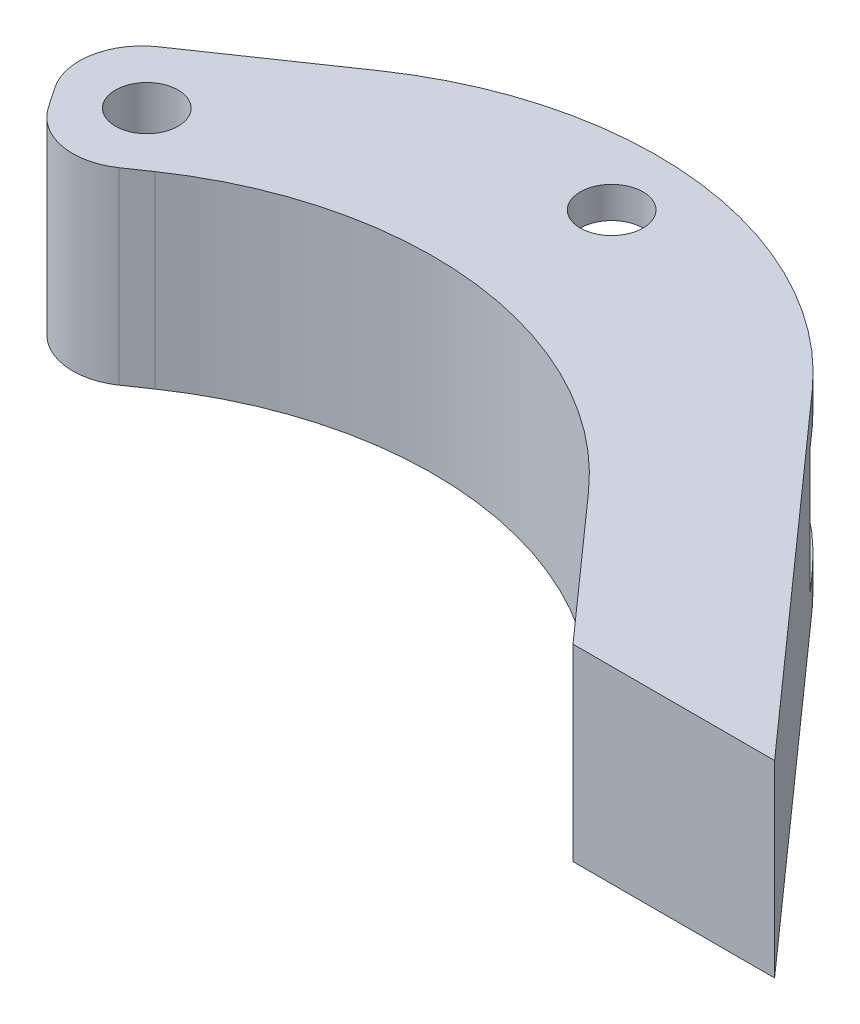
ISO-10303-21;
HEADER;
FILE_DESCRIPTION(('STEP AP214'),'2;1');
FILE_NAME('part.step','',(''),(''),'','','');
FILE_SCHEMA(('AUTOMOTIVE_DESIGN { 1 0 10303 214 1 1 1 1 }'));
ENDSEC;
DATA;
#1=APPLICATION_CONTEXT('core data for automotive mechanical design processes');
#2=APPLICATION_PROTOCOL_DEFINITION('international standard','automotive_design',2000,#1);
#3=PRODUCT_CONTEXT('',#1,'mechanical');
#4=PRODUCT('Part','Part','',(#3));
#5=PRODUCT_RELATED_PRODUCT_CATEGORY('part','',(#4));
#6=PRODUCT_DEFINITION_FORMATION('','',#4);
#7=PRODUCT_DEFINITION_CONTEXT('part definition',#1,'design');
#8=PRODUCT_DEFINITION('design','',#6,#7);
#9=PRODUCT_DEFINITION_SHAPE('','',#8);
#10=(LENGTH_UNIT() NAMED_UNIT(*) SI_UNIT(.MILLI.,.METRE.));
#11=(NAMED_UNIT(*) PLANE_ANGLE_UNIT() SI_UNIT($,.RADIAN.));
#12=(NAMED_UNIT(*) SI_UNIT($,.STERADIAN.) SOLID_ANGLE_UNIT());
#13=UNCERTAINTY_MEASURE_WITH_UNIT(LENGTH_MEASURE(1.E-05),#10,'distance_accuracy_value','');
#14=(GEOMETRIC_REPRESENTATION_CONTEXT(3) GLOBAL_UNCERTAINTY_ASSIGNED_CONTEXT((#13)) GLOBAL_UNIT_ASSIGNED_CONTEXT((#10,
#11,#12)) REPRESENTATION_CONTEXT('',''));
#15=CARTESIAN_POINT('',(0.,0.,0.));
#16=DIRECTION('',(0.,0.,1.));
#17=DIRECTION('',(1.,0.,0.));
#18=AXIS2_PLACEMENT_3D('',#15,#16,#17);
#19=CARTESIAN_POINT('',(-30.3581406285787,7.5,-7.05932040486833));
#20=DIRECTION('',(0.,-1.,0.));
#21=DIRECTION('',(0.,0.,-1.));
#22=AXIS2_PLACEMENT_3D('',#19,#20,#21);
#23=CYLINDRICAL_SURFACE('',#22,29.9999999999999);
#24=DIRECTION('',(0.,-1.,0.));
#25=VECTOR('',#24,1.);
#26=CARTESIAN_POINT('',(-7.93586106806909,7.5,-26.9902355697655));
#27=LINE('',#26,#25);
#28=CARTESIAN_POINT('',(-7.93586106806909,7.5,-26.9902355697655));
#29=VERTEX_POINT('',#28);
#30=CARTESIAN_POINT('',(-7.93586106806909,5.,-26.9902355697655));
#31=VERTEX_POINT('',#30);
#32=EDGE_CURVE('E300',#29,#31,#27,.T.);
#33=ORIENTED_EDGE('',*,*,#32,.T.);
#34=CARTESIAN_POINT('',(-30.3581406285787,5.,-7.05932040486833));
#35=DIRECTION('',(0.,1.,0.));
#36=DIRECTION('',(0.,0.,1.));
#37=AXIS2_PLACEMENT_3D('',#34,#35,#36);
#38=CIRCLE('',#37,29.9999999999999);
#39=CARTESIAN_POINT('',(-47.3009032933955,5.,-31.8170019054391));
#40=VERTEX_POINT('',#39);
#41=EDGE_CURVE('E175',#31,#40,#38,.T.);
#42=ORIENTED_EDGE('',*,*,#41,.T.);
#43=DIRECTION('',(0.,-1.,0.));
#44=VECTOR('',#43,1.);
#45=CARTESIAN_POINT('',(-47.3009032933955,7.5,-31.8170019054391));
#46=LINE('',#45,#44);
#47=CARTESIAN_POINT('',(-47.3009032933955,7.5,-31.8170019054391));
#48=VERTEX_POINT('',#47);
#49=EDGE_CURVE('E156',#48,#40,#46,.T.);
#50=ORIENTED_EDGE('',*,*,#49,.F.);
#51=CARTESIAN_POINT('',(-30.3581406285787,7.5,-7.05932040486833));
#52=DIRECTION('',(0.,1.,0.));
#53=DIRECTION('',(0.,0.,1.));
#54=AXIS2_PLACEMENT_3D('',#51,#52,#53);
#55=CIRCLE('',#54,29.9999999999999);
#56=EDGE_CURVE('E162',#29,#48,#55,.T.);
#57=ORIENTED_EDGE('',*,*,#56,.F.);
#58=EDGE_LOOP('',(#33,#42,#50,#57));
#59=FACE_BOUND('',#58,.T.);
#60=ADVANCED_FACE('F38',(#59),#23,.T.);
#61=CARTESIAN_POINT('',(-30.3581406285787,-5.,-7.05932040486833));
#62=DIRECTION('',(0.,1.,0.));
#63=DIRECTION('',(0.,0.,1.));
#64=AXIS2_PLACEMENT_3D('',#61,#62,#63);
#65=CIRCLE('',#64,29.9999999999999);
#66=CARTESIAN_POINT('',(-7.93586106806909,-5.,-26.9902355697655));
#67=VERTEX_POINT('',#66);
#68=CARTESIAN_POINT('',(-47.3009032933955,-5.,-31.8170019054391));
#69=VERTEX_POINT('',#68);
#70=EDGE_CURVE('E194',#67,#69,#65,.T.);
#71=ORIENTED_EDGE('',*,*,#70,.F.);
#72=CARTESIAN_POINT('',(-7.93586106806909,-7.5,-26.9902355697655));
#73=VERTEX_POINT('',#72);
#74=EDGE_CURVE('E304',#67,#73,#27,.T.);
#75=ORIENTED_EDGE('',*,*,#74,.T.);
#76=CARTESIAN_POINT('',(-30.3581406285787,-7.5,-7.05932040486833));
#77=DIRECTION('',(0.,1.,0.));
#78=DIRECTION('',(0.,0.,1.));
#79=AXIS2_PLACEMENT_3D('',#76,#77,#78);
#80=CIRCLE('',#79,29.9999999999999);
#81=CARTESIAN_POINT('',(-47.3009032933955,-7.5,-31.8170019054391));
#82=VERTEX_POINT('',#81);
#83=EDGE_CURVE('E285',#73,#82,#80,.T.);
#84=ORIENTED_EDGE('',*,*,#83,.T.);
#85=EDGE_CURVE('E178',#69,#82,#46,.T.);
#86=ORIENTED_EDGE('',*,*,#85,.F.);
#87=EDGE_LOOP('',(#71,#75,#84,#86));
#88=FACE_BOUND('',#87,.T.);
#89=ADVANCED_FACE('F425',(#88),#23,.T.);
#90=CARTESIAN_POINT('',(-28.4081340964653,7.5,-31.4870770961106));
#91=DIRECTION('',(0.,-1.,0.));
#92=DIRECTION('',(0.,0.,-1.));
#93=AXIS2_PLACEMENT_3D('',#90,#91,#92);
#94=CYLINDRICAL_SURFACE('',#93,2.50000000000039);
#95=CARTESIAN_POINT('',(-28.4081340964653,-7.5,-31.4870770961106));
#96=DIRECTION('',(0.,1.,0.));
#97=DIRECTION('',(0.,0.,1.));
#98=AXIS2_PLACEMENT_3D('',#95,#96,#97);
#99=CIRCLE('',#98,2.50000000000039);
#100=CARTESIAN_POINT('',(-28.4081340964653,-7.5,-28.9870770961103));
#101=VERTEX_POINT('',#100);
#102=EDGE_CURVE('E197',#101,#101,#99,.T.);
#103=ORIENTED_EDGE('',*,*,#102,.F.);
#104=EDGE_LOOP('',(#103));
#105=FACE_BOUND('',#104,.T.);
#106=CARTESIAN_POINT('',(-28.4081340964653,-5.,-31.4870770961106));
#107=DIRECTION('',(0.,1.,0.));
#108=DIRECTION('',(0.,0.,1.));
#109=AXIS2_PLACEMENT_3D('',#106,#107,#108);
#110=CIRCLE('',#109,2.50000000000039);
#111=CARTESIAN_POINT('',(-28.4081340964653,-5.,-28.9870770961103));
#112=VERTEX_POINT('',#111);
#113=EDGE_CURVE('E193',#112,#112,#110,.T.);
#114=ORIENTED_EDGE('',*,*,#113,.T.);
#115=EDGE_LOOP('',(#114));
#116=FACE_BOUND('',#115,.T.);
#117=ADVANCED_FACE('F401',(#105,#116),#94,.F.);
#118=CARTESIAN_POINT('',(-30.3581406285787,7.5,-7.05932040486833));
#119=DIRECTION('',(0.,1.,0.));
#120=DIRECTION('',(0.,0.,1.));
#121=AXIS2_PLACEMENT_3D('',#118,#119,#120);
#122=PLANE('',#121);
#123=CARTESIAN_POINT('',(-53.944540561611,7.5,-20.));
#124=DIRECTION('',(0.,1.,0.));
#125=DIRECTION('',(0.,0.,1.));
#126=AXIS2_PLACEMENT_3D('',#123,#124,#125);
#127=CIRCLE('',#126,2.50000000000039);
#128=CARTESIAN_POINT('',(-53.944540561611,7.5,-17.4999999999996));
#129=VERTEX_POINT('',#128);
#130=EDGE_CURVE('E340',#129,#129,#127,.T.);
#131=ORIENTED_EDGE('',*,*,#130,.F.);
#132=EDGE_LOOP('',(#131));
#133=FACE_BOUND('',#132,.T.);
#134=DIRECTION('',(0.564758755493913,0.,0.825256050019002));
#135=VECTOR('',#134,1.);
#136=CARTESIAN_POINT('',(-61.8385741237066,7.5,-21.8682388691462));
#137=LINE('',#136,#135);
#138=CARTESIAN_POINT('',(-59.014780346237,7.5,-17.7419586190511));
#139=VERTEX_POINT('',#138);
#140=CARTESIAN_POINT('',(-57.8852628352499,7.5,-16.0914465190141));
#141=VERTEX_POINT('',#140);
#142=EDGE_CURVE('E161',#139,#141,#137,.T.);
#143=ORIENTED_EDGE('',*,*,#142,.T.);
#144=CARTESIAN_POINT('',(-53.7589825851549,7.5,-18.9152402964837));
#145=DIRECTION('',(0.,1.,0.));
#146=DIRECTION('',(0.,0.,1.));
#147=AXIS2_PLACEMENT_3D('',#144,#145,#146);
#148=CIRCLE('',#147,5.);
#149=CARTESIAN_POINT('',(-50.9351888076855,7.5,-14.7889600463886));
#150=VERTEX_POINT('',#149);
#151=EDGE_CURVE('E47',#141,#150,#148,.T.);
#152=ORIENTED_EDGE('',*,*,#151,.T.);
#153=DIRECTION('',(0.825256050019026,0.,-0.564758755493879));
#154=VECTOR('',#153,1.);
#155=CARTESIAN_POINT('',(-49.2471616838488,7.5,-15.9441507265126));
#156=LINE('',#155,#154);
#157=CARTESIAN_POINT('',(-49.2471616838486,7.5,-15.9441507265122));
#158=VERTEX_POINT('',#157);
#159=EDGE_CURVE('E256',#150,#158,#156,.T.);
#160=ORIENTED_EDGE('',*,*,#159,.T.);
#161=CARTESIAN_POINT('',(-32.3043990190328,7.5,8.81353077405867));
#162=DIRECTION('',(0.,-1.,0.));
#163=DIRECTION('',(0.,0.,1.));
#164=AXIS2_PLACEMENT_3D('',#161,#162,#163);
#165=CIRCLE('',#164,29.9999999999998);
#166=CARTESIAN_POINT('',(-9.88211945852413,7.5,-11.1173843908392));
#167=VERTEX_POINT('',#166);
#168=EDGE_CURVE('E266',#158,#167,#165,.T.);
#169=ORIENTED_EDGE('',*,*,#168,.T.);
#170=DIRECTION('',(0.664363838829935,0.,0.747409318683646));
#171=VECTOR('',#170,1.);
#172=CARTESIAN_POINT('',(-9.88211945852413,7.5,-11.1173843908392));
#173=LINE('',#172,#171);
#174=CARTESIAN_POINT('',(0.,7.5,0.));
#175=VERTEX_POINT('',#174);
#176=EDGE_CURVE('E331',#167,#175,#173,.T.);
#177=ORIENTED_EDGE('',*,*,#176,.T.);
#178=DIRECTION('',(1.,0.,0.));
#179=VECTOR('',#178,1.);
#180=CARTESIAN_POINT('',(0.,7.5,0.));
#181=LINE('',#180,#179);
#182=CARTESIAN_POINT('',(16.0554594383884,7.5,0.));
#183=VERTEX_POINT('',#182);
#184=EDGE_CURVE('E329',#175,#183,#181,.T.);
#185=ORIENTED_EDGE('',*,*,#184,.T.);
#186=DIRECTION('',(-0.664363838829907,0.,-0.747409318683671));
#187=VECTOR('',#186,1.);
#188=CARTESIAN_POINT('',(-7.93586106806909,7.5,-26.9902355697655));
#189=LINE('',#188,#187);
#190=EDGE_CURVE('E168',#183,#29,#189,.T.);
#191=ORIENTED_EDGE('',*,*,#190,.T.);
#192=ORIENTED_EDGE('',*,*,#56,.T.);
#193=DIRECTION('',(-0.82525605001902,0.,0.564758755493888));
#194=VECTOR('',#193,1.);
#195=CARTESIAN_POINT('',(-47.3009032933955,7.5,-31.8170019054391));
#196=LINE('',#195,#194);
#197=CARTESIAN_POINT('',(-57.7122938736114,7.5,-24.6920326466158));
#198=VERTEX_POINT('',#197);
#199=EDGE_CURVE('E151',#48,#198,#196,.T.);
#200=ORIENTED_EDGE('',*,*,#199,.T.);
#201=CARTESIAN_POINT('',(-54.888500096142,7.5,-20.5657523965207));
#202=DIRECTION('',(0.,1.,0.));
#203=DIRECTION('',(0.,0.,1.));
#204=AXIS2_PLACEMENT_3D('',#201,#202,#203);
#205=CIRCLE('',#204,5.);
#206=EDGE_CURVE('E251',#198,#139,#205,.T.);
#207=ORIENTED_EDGE('',*,*,#206,.T.);
#208=EDGE_LOOP('',(#143,#152,#160,#169,#177,#185,#191,#192,#200,#207));
#209=FACE_BOUND('',#208,.T.);
#210=CARTESIAN_POINT('',(-28.4081340964653,7.5,-31.4870770961106));
#211=DIRECTION('',(0.,1.,0.));
#212=DIRECTION('',(0.,0.,1.));
#213=AXIS2_PLACEMENT_3D('',#210,#211,#212);
#214=CIRCLE('',#213,2.50000000000039);
#215=CARTESIAN_POINT('',(-28.4081340964653,7.5,-28.9870770961103));
#216=VERTEX_POINT('',#215);
#217=EDGE_CURVE('E352',#216,#216,#214,.T.);
#218=ORIENTED_EDGE('',*,*,#217,.F.);
#219=EDGE_LOOP('',(#218));
#220=FACE_BOUND('',#219,.T.);
#221=ADVANCED_FACE('F165',(#133,#209,#220),#122,.T.);
#222=CARTESIAN_POINT('',(-30.3581406285787,-7.5,-7.05932040486833));
#223=DIRECTION('',(0.,1.,0.));
#224=DIRECTION('',(0.,0.,1.));
#225=AXIS2_PLACEMENT_3D('',#222,#223,#224);
#226=PLANE('',#225);
#227=DIRECTION('',(0.825256050019026,0.,-0.564758755493879));
#228=VECTOR('',#227,1.);
#229=CARTESIAN_POINT('',(-49.2471616838488,-7.5,-15.9441507265126));
#230=LINE('',#229,#228);
#231=CARTESIAN_POINT('',(-50.9351888076855,-7.5,-14.7889600463886));
#232=VERTEX_POINT('',#231);
#233=CARTESIAN_POINT('',(-49.2471616838486,-7.5,-15.9441507265122));
#234=VERTEX_POINT('',#233);
#235=EDGE_CURVE('E275',#232,#234,#230,.T.);
#236=ORIENTED_EDGE('',*,*,#235,.F.);
#237=CARTESIAN_POINT('',(-53.7589825851549,-7.5,-18.9152402964837));
#238=DIRECTION('',(0.,1.,0.));
#239=DIRECTION('',(0.,0.,1.));
#240=AXIS2_PLACEMENT_3D('',#237,#238,#239);
#241=CIRCLE('',#240,5.);
#242=CARTESIAN_POINT('',(-57.8852628352499,-7.5,-16.0914465190141));
#243=VERTEX_POINT('',#242);
#244=EDGE_CURVE('E242',#232,#243,#241,.F.);
#245=ORIENTED_EDGE('',*,*,#244,.T.);
#246=DIRECTION('',(0.564758755493913,0.,0.825256050019002));
#247=VECTOR('',#246,1.);
#248=CARTESIAN_POINT('',(-61.8385741237066,-7.5,-21.8682388691462));
#249=LINE('',#248,#247);
#250=CARTESIAN_POINT('',(-59.014780346237,-7.5,-17.7419586190511));
#251=VERTEX_POINT('',#250);
#252=EDGE_CURVE('E273',#251,#243,#249,.T.);
#253=ORIENTED_EDGE('',*,*,#252,.F.);
#254=CARTESIAN_POINT('',(-54.888500096142,-7.5,-20.5657523965207));
#255=DIRECTION('',(0.,1.,0.));
#256=DIRECTION('',(0.,0.,1.));
#257=AXIS2_PLACEMENT_3D('',#254,#255,#256);
#258=CIRCLE('',#257,5.);
#259=CARTESIAN_POINT('',(-57.7122938736114,-7.5,-24.6920326466158));
#260=VERTEX_POINT('',#259);
#261=EDGE_CURVE('E239',#251,#260,#258,.F.);
#262=ORIENTED_EDGE('',*,*,#261,.T.);
#263=DIRECTION('',(-0.82525605001902,0.,0.564758755493888));
#264=VECTOR('',#263,1.);
#265=CARTESIAN_POINT('',(-47.3009032933955,-7.5,-31.8170019054391));
#266=LINE('',#265,#264);
#267=EDGE_CURVE('E279',#82,#260,#266,.T.);
#268=ORIENTED_EDGE('',*,*,#267,.F.);
#269=ORIENTED_EDGE('',*,*,#83,.F.);
#270=DIRECTION('',(-0.664363838829907,0.,-0.747409318683671));
#271=VECTOR('',#270,1.);
#272=CARTESIAN_POINT('',(-7.93586106806909,-7.5,-26.9902355697655));
#273=LINE('',#272,#271);
#274=CARTESIAN_POINT('',(16.0554594383884,-7.5,0.));
#275=VERTEX_POINT('',#274);
#276=EDGE_CURVE('E173',#275,#73,#273,.T.);
#277=ORIENTED_EDGE('',*,*,#276,.F.);
#278=DIRECTION('',(1.,0.,0.));
#279=VECTOR('',#278,1.);
#280=CARTESIAN_POINT('',(0.,-7.5,0.));
#281=LINE('',#280,#279);
#282=CARTESIAN_POINT('',(0.,-7.5,0.));
#283=VERTEX_POINT('',#282);
#284=EDGE_CURVE('E294',#283,#275,#281,.T.);
#285=ORIENTED_EDGE('',*,*,#284,.F.);
#286=DIRECTION('',(0.664363838829935,0.,0.747409318683646));
#287=VECTOR('',#286,1.);
#288=CARTESIAN_POINT('',(-9.88211945852413,-7.5,-11.1173843908392));
#289=LINE('',#288,#287);
#290=CARTESIAN_POINT('',(-9.88211945852413,-7.5,-11.1173843908392));
#291=VERTEX_POINT('',#290);
#292=EDGE_CURVE('E291',#291,#283,#289,.T.);
#293=ORIENTED_EDGE('',*,*,#292,.F.);
#294=CARTESIAN_POINT('',(-32.3043990190328,-7.5,8.81353077405867));
#295=DIRECTION('',(0.,-1.,0.));
#296=DIRECTION('',(0.,0.,1.));
#297=AXIS2_PLACEMENT_3D('',#294,#295,#296);
#298=CIRCLE('',#297,29.9999999999998);
#299=EDGE_CURVE('E283',#234,#291,#298,.T.);
#300=ORIENTED_EDGE('',*,*,#299,.F.);
#301=EDGE_LOOP('',(#236,#245,#253,#262,#268,#269,#277,#285,#293,#300));
#302=FACE_BOUND('',#301,.T.);
#303=CARTESIAN_POINT('',(-53.944540561611,-7.5,-20.));
#304=DIRECTION('',(0.,1.,0.));
#305=DIRECTION('',(0.,0.,1.));
#306=AXIS2_PLACEMENT_3D('',#303,#304,#305);
#307=CIRCLE('',#306,2.50000000000039);
#308=CARTESIAN_POINT('',(-53.944540561611,-7.5,-17.4999999999996));
#309=VERTEX_POINT('',#308);
#310=EDGE_CURVE('E346',#309,#309,#307,.T.);
#311=ORIENTED_EDGE('',*,*,#310,.T.);
#312=EDGE_LOOP('',(#311));
#313=FACE_BOUND('',#312,.T.);
#314=ORIENTED_EDGE('',*,*,#102,.T.);
#315=EDGE_LOOP('',(#314));
#316=FACE_BOUND('',#315,.T.);
#317=ADVANCED_FACE('F271',(#302,#313,#316),#226,.F.);
#318=CARTESIAN_POINT('',(-47.3009032933955,7.5,-31.8170019054391));
#319=DIRECTION('',(0.564758755493888,0.,0.82525605001902));
#320=DIRECTION('',(0.82525605001902,0.,-0.564758755493888));
#321=AXIS2_PLACEMENT_3D('',#318,#319,#320);
#322=PLANE('',#321);
#323=ORIENTED_EDGE('',*,*,#267,.T.);
#324=DIRECTION('',(0.,-1.,0.));
#325=VECTOR('',#324,1.);
#326=CARTESIAN_POINT('',(-57.7122938736114,7.5,-24.6920326466158));
#327=LINE('',#326,#325);
#328=EDGE_CURVE('E11',#260,#198,#327,.F.);
#329=ORIENTED_EDGE('',*,*,#328,.T.);
#330=ORIENTED_EDGE('',*,*,#199,.F.);
#331=ORIENTED_EDGE('',*,*,#49,.T.);
#332=DIRECTION('',(-0.82525605001902,0.,0.564758755493888));
#333=VECTOR('',#332,1.);
#334=CARTESIAN_POINT('',(-47.3009032933955,5.,-31.8170019054391));
#335=LINE('',#334,#333);
#336=CARTESIAN_POINT('',(-51.0911675483358,5.,-29.2231585478973));
#337=VERTEX_POINT('',#336);
#338=EDGE_CURVE('E220',#40,#337,#335,.T.);
#339=ORIENTED_EDGE('',*,*,#338,.T.);
#340=DIRECTION('',(0.,-1.,0.));
#341=VECTOR('',#340,1.);
#342=CARTESIAN_POINT('',(-51.0911675483358,-5.,-29.2231585478973));
#343=LINE('',#342,#341);
#344=CARTESIAN_POINT('',(-51.0911675483358,-5.,-29.2231585478973));
#345=VERTEX_POINT('',#344);
#346=EDGE_CURVE('E216',#337,#345,#343,.T.);
#347=ORIENTED_EDGE('',*,*,#346,.T.);
#348=DIRECTION('',(0.82525605001902,0.,-0.564758755493888));
#349=VECTOR('',#348,1.);
#350=CARTESIAN_POINT('',(-29.9157076075368,-5.,-43.7144505570873));
#351=LINE('',#350,#349);
#352=EDGE_CURVE('E213',#345,#69,#351,.T.);
#353=ORIENTED_EDGE('',*,*,#352,.T.);
#354=ORIENTED_EDGE('',*,*,#85,.T.);
#355=EDGE_LOOP('',(#323,#329,#330,#331,#339,#347,#353,#354));
#356=FACE_BOUND('',#355,.T.);
#357=ADVANCED_FACE('F153',(#356),#322,.F.);
#358=CARTESIAN_POINT('',(-61.8385741237066,7.5,-21.8682388691462));
#359=DIRECTION('',(0.825256050019002,0.,-0.564758755493913));
#360=DIRECTION('',(-0.564758755493913,0.,-0.825256050019002));
#361=AXIS2_PLACEMENT_3D('',#358,#359,#360);
#362=PLANE('',#361);
#363=ORIENTED_EDGE('',*,*,#252,.T.);
#364=DIRECTION('',(0.,-1.,0.));
#365=VECTOR('',#364,1.);
#366=CARTESIAN_POINT('',(-57.8852628352499,7.5,-16.0914465190141));
#367=LINE('',#366,#365);
#368=EDGE_CURVE('E60',#243,#141,#367,.F.);
#369=ORIENTED_EDGE('',*,*,#368,.T.);
#370=ORIENTED_EDGE('',*,*,#142,.F.);
#371=DIRECTION('',(0.,-1.,0.));
#372=VECTOR('',#371,1.);
#373=CARTESIAN_POINT('',(-59.014780346237,7.5,-17.7419586190511));
#374=LINE('',#373,#372);
#375=EDGE_CURVE('E245',#139,#251,#374,.T.);
#376=ORIENTED_EDGE('',*,*,#375,.T.);
#377=EDGE_LOOP('',(#363,#369,#370,#376));
#378=FACE_BOUND('',#377,.T.);
#379=ADVANCED_FACE('F276',(#378),#362,.F.);
#380=CARTESIAN_POINT('',(-49.2471616838488,7.5,-15.9441507265126));
#381=DIRECTION('',(-0.564758755493879,0.,-0.825256050019026));
#382=DIRECTION('',(-0.825256050019026,0.,0.564758755493879));
#383=AXIS2_PLACEMENT_3D('',#380,#381,#382);
#384=PLANE('',#383);
#385=ORIENTED_EDGE('',*,*,#159,.F.);
#386=DIRECTION('',(0.,-1.,0.));
#387=VECTOR('',#386,1.);
#388=CARTESIAN_POINT('',(-50.9351888076855,7.5,-14.7889600463886));
#389=LINE('',#388,#387);
#390=EDGE_CURVE('E235',#150,#232,#389,.T.);
#391=ORIENTED_EDGE('',*,*,#390,.T.);
#392=ORIENTED_EDGE('',*,*,#235,.T.);
#393=DIRECTION('',(0.,-1.,0.));
#394=VECTOR('',#393,1.);
#395=CARTESIAN_POINT('',(-49.2471616838486,7.5,-15.9441507265122));
#396=LINE('',#395,#394);
#397=EDGE_CURVE('E185',#158,#234,#396,.T.);
#398=ORIENTED_EDGE('',*,*,#397,.F.);
#399=EDGE_LOOP('',(#385,#391,#392,#398));
#400=FACE_BOUND('',#399,.T.);
#401=ADVANCED_FACE('F261',(#400),#384,.F.);
#402=CARTESIAN_POINT('',(-32.3043990190328,7.5,8.81353077405867));
#403=DIRECTION('',(0.,-1.,0.));
#404=DIRECTION('',(0.,0.,-1.));
#405=AXIS2_PLACEMENT_3D('',#402,#403,#404);
#406=CYLINDRICAL_SURFACE('',#405,29.9999999999998);
#407=ORIENTED_EDGE('',*,*,#299,.T.);
#408=DIRECTION('',(0.,-1.,0.));
#409=VECTOR('',#408,1.);
#410=CARTESIAN_POINT('',(-9.88211945852413,7.5,-11.1173843908392));
#411=LINE('',#410,#409);
#412=EDGE_CURVE('E311',#167,#291,#411,.T.);
#413=ORIENTED_EDGE('',*,*,#412,.F.);
#414=ORIENTED_EDGE('',*,*,#168,.F.);
#415=ORIENTED_EDGE('',*,*,#397,.T.);
#416=EDGE_LOOP('',(#407,#413,#414,#415));
#417=FACE_BOUND('',#416,.T.);
#418=ADVANCED_FACE('F320',(#417),#406,.F.);
#419=CARTESIAN_POINT('',(-9.88211945852413,7.5,-11.1173843908392));
#420=DIRECTION('',(0.747409318683646,0.,-0.664363838829935));
#421=DIRECTION('',(-0.664363838829935,0.,-0.747409318683647));
#422=AXIS2_PLACEMENT_3D('',#419,#420,#421);
#423=PLANE('',#422);
#424=ORIENTED_EDGE('',*,*,#292,.T.);
#425=DIRECTION('',(0.,-1.,0.));
#426=VECTOR('',#425,1.);
#427=CARTESIAN_POINT('',(0.,7.5,0.));
#428=LINE('',#427,#426);
#429=EDGE_CURVE('E308',#175,#283,#428,.T.);
#430=ORIENTED_EDGE('',*,*,#429,.F.);
#431=ORIENTED_EDGE('',*,*,#176,.F.);
#432=ORIENTED_EDGE('',*,*,#412,.T.);
#433=EDGE_LOOP('',(#424,#430,#431,#432));
#434=FACE_BOUND('',#433,.T.);
#435=ADVANCED_FACE('F324',(#434),#423,.F.);
#436=CARTESIAN_POINT('',(0.,7.5,0.));
#437=DIRECTION('',(0.,0.,-1.));
#438=DIRECTION('',(-1.,0.,0.));
#439=AXIS2_PLACEMENT_3D('',#436,#437,#438);
#440=PLANE('',#439);
#441=ORIENTED_EDGE('',*,*,#284,.T.);
#442=DIRECTION('',(0.,-1.,0.));
#443=VECTOR('',#442,1.);
#444=CARTESIAN_POINT('',(16.0554594383884,7.5,0.));
#445=LINE('',#444,#443);
#446=EDGE_CURVE('E303',#183,#275,#445,.T.);
#447=ORIENTED_EDGE('',*,*,#446,.F.);
#448=ORIENTED_EDGE('',*,*,#184,.F.);
#449=ORIENTED_EDGE('',*,*,#429,.T.);
#450=EDGE_LOOP('',(#441,#447,#448,#449));
#451=FACE_BOUND('',#450,.T.);
#452=ADVANCED_FACE('F327',(#451),#440,.F.);
#453=CARTESIAN_POINT('',(-7.93586106806909,7.5,-26.9902355697655));
#454=DIRECTION('',(-0.747409318683671,0.,0.664363838829908));
#455=DIRECTION('',(0.664363838829908,0.,0.747409318683671));
#456=AXIS2_PLACEMENT_3D('',#453,#454,#455);
#457=PLANE('',#456);
#458=DIRECTION('',(0.,-1.,0.));
#459=VECTOR('',#458,1.);
#460=CARTESIAN_POINT('',(-6.59618197140176,5.,-25.4830965860147));
#461=LINE('',#460,#459);
#462=CARTESIAN_POINT('',(-6.59618197140176,-5.,-25.4830965860147));
#463=VERTEX_POINT('',#462);
#464=CARTESIAN_POINT('',(-6.59618197140176,5.,-25.4830965860147));
#465=VERTEX_POINT('',#464);
#466=EDGE_CURVE('E183',#463,#465,#461,.F.);
#467=ORIENTED_EDGE('',*,*,#466,.T.);
#468=DIRECTION('',(-0.664363838829908,0.,-0.747409318683671));
#469=VECTOR('',#468,1.);
#470=CARTESIAN_POINT('',(-7.93586106806909,5.,-26.9902355697655));
#471=LINE('',#470,#469);
#472=EDGE_CURVE('E202',#465,#31,#471,.T.);
#473=ORIENTED_EDGE('',*,*,#472,.T.);
#474=ORIENTED_EDGE('',*,*,#32,.F.);
#475=ORIENTED_EDGE('',*,*,#190,.F.);
#476=ORIENTED_EDGE('',*,*,#446,.T.);
#477=ORIENTED_EDGE('',*,*,#276,.T.);
#478=ORIENTED_EDGE('',*,*,#74,.F.);
#479=DIRECTION('',(0.664363838829908,0.,0.747409318683671));
#480=VECTOR('',#479,1.);
#481=CARTESIAN_POINT('',(8.96891182420342,-5.,-7.97236606595833));
#482=LINE('',#481,#480);
#483=EDGE_CURVE('E177',#67,#463,#482,.T.);
#484=ORIENTED_EDGE('',*,*,#483,.T.);
#485=EDGE_LOOP('',(#467,#473,#474,#475,#476,#477,#478,#484));
#486=FACE_BOUND('',#485,.T.);
#487=ADVANCED_FACE('F404',(#486),#457,.F.);
#488=CARTESIAN_POINT('',(-53.944540561611,7.5,-20.));
#489=DIRECTION('',(0.,-1.,0.));
#490=DIRECTION('',(0.,0.,-1.));
#491=AXIS2_PLACEMENT_3D('',#488,#489,#490);
#492=CYLINDRICAL_SURFACE('',#491,2.50000000000039);
#493=ORIENTED_EDGE('',*,*,#130,.T.);
#494=EDGE_LOOP('',(#493));
#495=FACE_BOUND('',#494,.T.);
#496=ORIENTED_EDGE('',*,*,#310,.F.);
#497=EDGE_LOOP('',(#496));
#498=FACE_BOUND('',#497,.T.);
#499=ADVANCED_FACE('F399',(#495,#498),#492,.F.);
#500=CARTESIAN_POINT('',(-28.4081340964653,5.,-31.4870770961106));
#501=DIRECTION('',(0.,1.,0.));
#502=DIRECTION('',(0.,0.,1.));
#503=AXIS2_PLACEMENT_3D('',#500,#501,#502);
#504=CIRCLE('',#503,2.50000000000039);
#505=CARTESIAN_POINT('',(-28.4081340964653,5.,-28.9870770961103));
#506=VERTEX_POINT('',#505);
#507=EDGE_CURVE('E189',#506,#506,#504,.T.);
#508=ORIENTED_EDGE('',*,*,#507,.F.);
#509=EDGE_LOOP('',(#508));
#510=FACE_BOUND('',#509,.T.);
#511=ORIENTED_EDGE('',*,*,#217,.T.);
#512=EDGE_LOOP('',(#511));
#513=FACE_BOUND('',#512,.T.);
#514=ADVANCED_FACE('F393',(#510,#513),#94,.F.);
#515=CARTESIAN_POINT('',(-14.7922467300764,-5.,-32.7050402649262));
#516=CARTESIAN_POINT('',(-17.3318718121445,-5.,-26.2159663661088));
#517=CARTESIAN_POINT('',(-31.2968580965968,-5.,-23.2593352938933));
#518=CARTESIAN_POINT('',(-41.248027480622,-5.,-30.9651322788954));
#519=CARTESIAN_POINT('',(-47.3009032933955,-5.,-31.8170019054391));
#520=B_SPLINE_CURVE_WITH_KNOTS('',3,(#515,#516,#517,#518,#519),.UNSPECIFIED.,.F.,.F.,(4,1,4),
(0.,0.502708051975213,1.),.UNSPECIFIED.);
#521=DIRECTION('',(0.,1.,0.));
#522=VECTOR('',#521,1.);
#523=SURFACE_OF_LINEAR_EXTRUSION('',#520,#522);
#524=CARTESIAN_POINT('',(-14.7922467300764,5.,-32.7050402649262));
#525=CARTESIAN_POINT('',(-17.3318718121445,5.,-26.2159663661088));
#526=CARTESIAN_POINT('',(-31.2968580965968,5.,-23.2593352938933));
#527=CARTESIAN_POINT('',(-41.248027480622,5.,-30.9651322788954));
#528=CARTESIAN_POINT('',(-47.3009032933955,5.,-31.8170019054391));
#529=B_SPLINE_CURVE_WITH_KNOTS('',3,(#524,#525,#526,#527,#528),.UNSPECIFIED.,.F.,.F.,(4,1,4),
(0.,0.502708051975213,1.),.UNSPECIFIED.);
#530=CARTESIAN_POINT('',(-19.2219528173823,5.,-27.4103518090189));
#531=VERTEX_POINT('',#530);
#532=CARTESIAN_POINT('',(-41.7964391271005,5.,-30.2817936477034));
#533=VERTEX_POINT('',#532);
#534=EDGE_CURVE('E367',#531,#533,#529,.T.);
#535=ORIENTED_EDGE('',*,*,#534,.F.);
#536=DIRECTION('',(0.,1.,0.));
#537=VECTOR('',#536,1.);
#538=CARTESIAN_POINT('',(-19.2219528173823,5.,-27.4103518090189));
#539=LINE('',#538,#537);
#540=CARTESIAN_POINT('',(-19.2219528173823,-5.,-27.4103518090189));
#541=VERTEX_POINT('',#540);
#542=EDGE_CURVE('E210',#531,#541,#539,.F.);
#543=ORIENTED_EDGE('',*,*,#542,.T.);
#544=CARTESIAN_POINT('',(-41.7964391271005,-5.,-30.2817936477034));
#545=VERTEX_POINT('',#544);
#546=EDGE_CURVE('E366',#541,#545,#520,.T.);
#547=ORIENTED_EDGE('',*,*,#546,.T.);
#548=DIRECTION('',(0.,1.,0.));
#549=VECTOR('',#548,1.);
#550=CARTESIAN_POINT('',(-41.7964391271005,-5.,-30.2817936477034));
#551=LINE('',#550,#549);
#552=EDGE_CURVE('E206',#545,#533,#551,.T.);
#553=ORIENTED_EDGE('',*,*,#552,.T.);
#554=EDGE_LOOP('',(#535,#543,#547,#553));
#555=FACE_BOUND('',#554,.T.);
#556=ADVANCED_FACE('F388',(#555),#523,.T.);
#557=CARTESIAN_POINT('',(0.,-5.,0.));
#558=DIRECTION('',(0.,1.,0.));
#559=DIRECTION('',(0.,0.,1.));
#560=AXIS2_PLACEMENT_3D('',#557,#558,#559);
#561=PLANE('',#560);
#562=ORIENTED_EDGE('',*,*,#113,.F.);
#563=EDGE_LOOP('',(#562));
#564=FACE_BOUND('',#563,.T.);
#565=ORIENTED_EDGE('',*,*,#546,.F.);
#566=CARTESIAN_POINT('',(-14.0702751582385,-5.,-18.8394581977156));
#567=DIRECTION('',(0.,1.,0.));
#568=DIRECTION('',(0.,0.,1.));
#569=AXIS2_PLACEMENT_3D('',#566,#567,#568);
#570=CIRCLE('',#569,10.);
#571=EDGE_CURVE('E226',#541,#463,#570,.F.);
#572=ORIENTED_EDGE('',*,*,#571,.T.);
#573=ORIENTED_EDGE('',*,*,#483,.F.);
#574=ORIENTED_EDGE('',*,*,#70,.T.);
#575=ORIENTED_EDGE('',*,*,#352,.F.);
#576=CARTESIAN_POINT('',(-45.4435799933969,-5.,-20.9705980477071));
#577=DIRECTION('',(0.,1.,0.));
#578=DIRECTION('',(0.,0.,1.));
#579=AXIS2_PLACEMENT_3D('',#576,#577,#578);
#580=CIRCLE('',#579,10.);
#581=EDGE_CURVE('E232',#345,#545,#580,.F.);
#582=ORIENTED_EDGE('',*,*,#581,.T.);
#583=EDGE_LOOP('',(#565,#572,#573,#574,#575,#582));
#584=FACE_BOUND('',#583,.T.);
#585=ADVANCED_FACE('F392',(#564,#584),#561,.T.);
#586=CARTESIAN_POINT('',(0.,5.,0.));
#587=DIRECTION('',(0.,1.,0.));
#588=DIRECTION('',(0.,0.,1.));
#589=AXIS2_PLACEMENT_3D('',#586,#587,#588);
#590=PLANE('',#589);
#591=ORIENTED_EDGE('',*,*,#507,.T.);
#592=EDGE_LOOP('',(#591));
#593=FACE_BOUND('',#592,.T.);
#594=ORIENTED_EDGE('',*,*,#41,.F.);
#595=ORIENTED_EDGE('',*,*,#472,.F.);
#596=CARTESIAN_POINT('',(-14.0702751582385,5.,-18.8394581977156));
#597=DIRECTION('',(0.,1.,0.));
#598=DIRECTION('',(0.,0.,1.));
#599=AXIS2_PLACEMENT_3D('',#596,#597,#598);
#600=CIRCLE('',#599,10.);
#601=EDGE_CURVE('E223',#465,#531,#600,.T.);
#602=ORIENTED_EDGE('',*,*,#601,.T.);
#603=ORIENTED_EDGE('',*,*,#534,.T.);
#604=CARTESIAN_POINT('',(-45.4435799933969,5.,-20.9705980477071));
#605=DIRECTION('',(0.,1.,0.));
#606=DIRECTION('',(0.,0.,1.));
#607=AXIS2_PLACEMENT_3D('',#604,#605,#606);
#608=CIRCLE('',#607,10.);
#609=EDGE_CURVE('E229',#533,#337,#608,.T.);
#610=ORIENTED_EDGE('',*,*,#609,.T.);
#611=ORIENTED_EDGE('',*,*,#338,.F.);
#612=EDGE_LOOP('',(#594,#595,#602,#603,#610,#611));
#613=FACE_BOUND('',#612,.T.);
#614=ADVANCED_FACE('F395',(#593,#613),#590,.F.);
#615=CARTESIAN_POINT('',(-14.0702751582385,0.,-18.8394581977156));
#616=DIRECTION('',(0.,1.,0.));
#617=DIRECTION('',(0.,0.,1.));
#618=AXIS2_PLACEMENT_3D('',#615,#616,#617);
#619=CYLINDRICAL_SURFACE('',#618,10.);
#620=ORIENTED_EDGE('',*,*,#571,.F.);
#621=ORIENTED_EDGE('',*,*,#542,.F.);
#622=ORIENTED_EDGE('',*,*,#601,.F.);
#623=ORIENTED_EDGE('',*,*,#466,.F.);
#624=EDGE_LOOP('',(#620,#621,#622,#623));
#625=FACE_BOUND('',#624,.T.);
#626=ADVANCED_FACE('F428',(#625),#619,.T.);
#627=CARTESIAN_POINT('',(-45.4435799933969,0.,-20.9705980477071));
#628=DIRECTION('',(0.,1.,0.));
#629=DIRECTION('',(0.,0.,1.));
#630=AXIS2_PLACEMENT_3D('',#627,#628,#629);
#631=CYLINDRICAL_SURFACE('',#630,10.);
#632=ORIENTED_EDGE('',*,*,#581,.F.);
#633=ORIENTED_EDGE('',*,*,#346,.F.);
#634=ORIENTED_EDGE('',*,*,#609,.F.);
#635=ORIENTED_EDGE('',*,*,#552,.F.);
#636=EDGE_LOOP('',(#632,#633,#634,#635));
#637=FACE_BOUND('',#636,.T.);
#638=ADVANCED_FACE('F431',(#637),#631,.T.);
#639=CARTESIAN_POINT('',(-53.7589825851549,7.5,-18.9152402964837));
#640=DIRECTION('',(0.,-1.,0.));
#641=DIRECTION('',(0.,0.,-1.));
#642=AXIS2_PLACEMENT_3D('',#639,#640,#641);
#643=CYLINDRICAL_SURFACE('',#642,5.);
#644=ORIENTED_EDGE('',*,*,#151,.F.);
#645=ORIENTED_EDGE('',*,*,#368,.F.);
#646=ORIENTED_EDGE('',*,*,#244,.F.);
#647=ORIENTED_EDGE('',*,*,#390,.F.);
#648=EDGE_LOOP('',(#644,#645,#646,#647));
#649=FACE_BOUND('',#648,.T.);
#650=ADVANCED_FACE('F268',(#649),#643,.T.);
#651=CARTESIAN_POINT('',(-54.888500096142,7.5,-20.5657523965207));
#652=DIRECTION('',(0.,-1.,0.));
#653=DIRECTION('',(0.,0.,-1.));
#654=AXIS2_PLACEMENT_3D('',#651,#652,#653);
#655=CYLINDRICAL_SURFACE('',#654,5.);
#656=ORIENTED_EDGE('',*,*,#206,.F.);
#657=ORIENTED_EDGE('',*,*,#328,.F.);
#658=ORIENTED_EDGE('',*,*,#261,.F.);
#659=ORIENTED_EDGE('',*,*,#375,.F.);
#660=EDGE_LOOP('',(#656,#657,#658,#659));
#661=FACE_BOUND('',#660,.T.);
#662=ADVANCED_FACE('F40',(#661),#655,.T.);
#663=CLOSED_SHELL('',(#60,#89,#117,#221,#317,#357,#379,#401,#418,#435,#452,#487,#499,#514,#556,
#585,#614,#626,#638,#650,#662));
#664=MANIFOLD_SOLID_BREP('B2',#663);
#665=ADVANCED_BREP_SHAPE_REPRESENTATION('',(#18,#664),#14);
#666=SHAPE_DEFINITION_REPRESENTATION(#9,#665);
ENDSEC;
END-ISO-10303-21;
